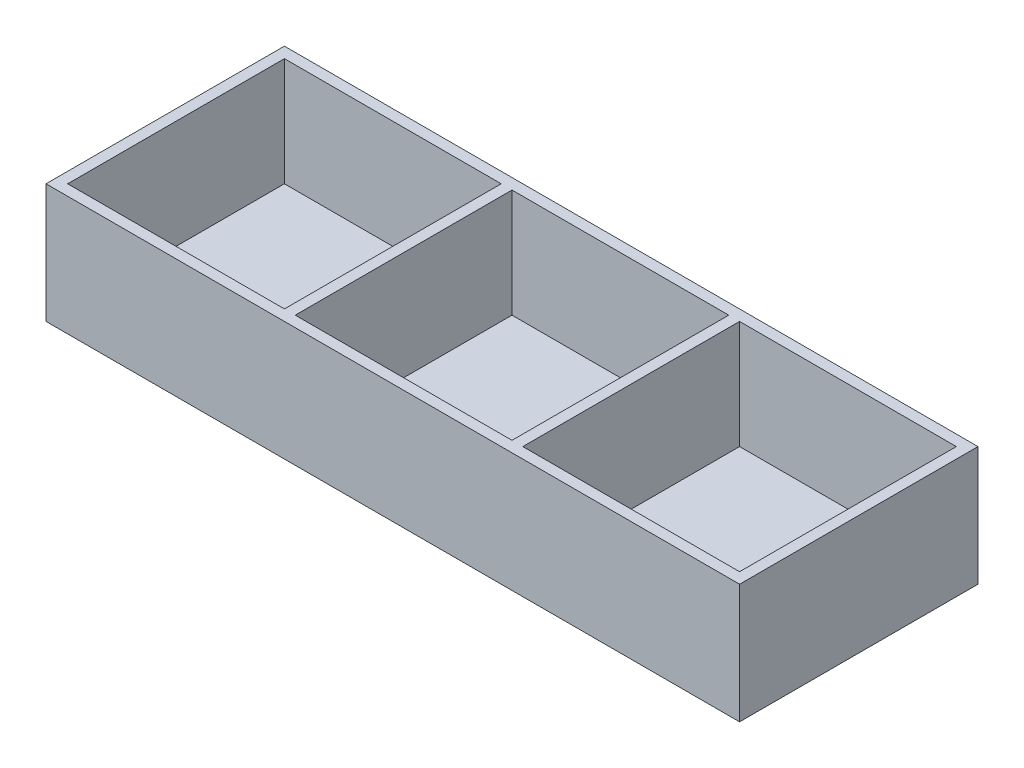
ISO-10303-21;
HEADER;
FILE_DESCRIPTION(('STEP AP214'),'2;1');
FILE_NAME('part.step','',(''),(''),'','','');
FILE_SCHEMA(('AUTOMOTIVE_DESIGN { 1 0 10303 214 1 1 1 1 }'));
ENDSEC;
DATA;
#1=APPLICATION_CONTEXT('core data for automotive mechanical design processes');
#2=APPLICATION_PROTOCOL_DEFINITION('international standard','automotive_design',2000,#1);
#3=PRODUCT_CONTEXT('',#1,'mechanical');
#4=PRODUCT('Part','Part','',(#3));
#5=PRODUCT_RELATED_PRODUCT_CATEGORY('part','',(#4));
#6=PRODUCT_DEFINITION_FORMATION('','',#4);
#7=PRODUCT_DEFINITION_CONTEXT('part definition',#1,'design');
#8=PRODUCT_DEFINITION('design','',#6,#7);
#9=PRODUCT_DEFINITION_SHAPE('','',#8);
#10=(LENGTH_UNIT() NAMED_UNIT(*) SI_UNIT(.MILLI.,.METRE.));
#11=(NAMED_UNIT(*) PLANE_ANGLE_UNIT() SI_UNIT($,.RADIAN.));
#12=(NAMED_UNIT(*) SI_UNIT($,.STERADIAN.) SOLID_ANGLE_UNIT());
#13=UNCERTAINTY_MEASURE_WITH_UNIT(LENGTH_MEASURE(1.E-05),#10,'distance_accuracy_value','');
#14=(GEOMETRIC_REPRESENTATION_CONTEXT(3) GLOBAL_UNCERTAINTY_ASSIGNED_CONTEXT((#13)) GLOBAL_UNIT_ASSIGNED_CONTEXT((#10,
#11,#12)) REPRESENTATION_CONTEXT('',''));
#15=CARTESIAN_POINT('',(0.,0.,0.));
#16=DIRECTION('',(0.,0.,1.));
#17=DIRECTION('',(1.,0.,0.));
#18=AXIS2_PLACEMENT_3D('',#15,#16,#17);
#19=CARTESIAN_POINT('',(-160.,55.,-50.));
#20=DIRECTION('',(0.,0.,1.));
#21=DIRECTION('',(1.,0.,0.));
#22=AXIS2_PLACEMENT_3D('',#19,#20,#21);
#23=PLANE('',#22);
#24=DIRECTION('',(-1.,0.,0.));
#25=VECTOR('',#24,1.);
#26=CARTESIAN_POINT('',(0.,5.,-50.));
#27=LINE('',#26,#25);
#28=CARTESIAN_POINT('',(-55.,5.00000000000001,-50.));
#29=VERTEX_POINT('',#28);
#30=CARTESIAN_POINT('',(-155.,5.,-50.));
#31=VERTEX_POINT('',#30);
#32=EDGE_CURVE('E229',#29,#31,#27,.T.);
#33=ORIENTED_EDGE('',*,*,#32,.F.);
#34=DIRECTION('',(0.,1.,0.));
#35=VECTOR('',#34,1.);
#36=CARTESIAN_POINT('',(-55.,55.,-50.));
#37=LINE('',#36,#35);
#38=CARTESIAN_POINT('',(-55.,55.,-50.));
#39=VERTEX_POINT('',#38);
#40=EDGE_CURVE('E267',#39,#29,#37,.F.);
#41=ORIENTED_EDGE('',*,*,#40,.F.);
#42=DIRECTION('',(-1.,0.,0.));
#43=VECTOR('',#42,1.);
#44=CARTESIAN_POINT('',(0.,55.,-50.));
#45=LINE('',#44,#43);
#46=CARTESIAN_POINT('',(-155.,55.,-50.));
#47=VERTEX_POINT('',#46);
#48=EDGE_CURVE('E252',#39,#47,#45,.T.);
#49=ORIENTED_EDGE('',*,*,#48,.T.);
#50=DIRECTION('',(0.,-1.,0.));
#51=VECTOR('',#50,1.);
#52=CARTESIAN_POINT('',(-155.,55.,-50.));
#53=LINE('',#52,#51);
#54=EDGE_CURVE('E233',#47,#31,#53,.T.);
#55=ORIENTED_EDGE('',*,*,#54,.T.);
#56=EDGE_LOOP('',(#33,#41,#49,#55));
#57=FACE_BOUND('',#56,.T.);
#58=ADVANCED_FACE('F34',(#57),#23,.T.);
#59=CARTESIAN_POINT('',(-160.,55.,50.));
#60=DIRECTION('',(0.,0.,-1.));
#61=DIRECTION('',(-1.,0.,0.));
#62=AXIS2_PLACEMENT_3D('',#59,#60,#61);
#63=PLANE('',#62);
#64=DIRECTION('',(1.,0.,0.));
#65=VECTOR('',#64,1.);
#66=CARTESIAN_POINT('',(0.,55.,50.));
#67=LINE('',#66,#65);
#68=CARTESIAN_POINT('',(-155.,55.,50.));
#69=VERTEX_POINT('',#68);
#70=CARTESIAN_POINT('',(-55.,55.,50.));
#71=VERTEX_POINT('',#70);
#72=EDGE_CURVE('E170',#69,#71,#67,.T.);
#73=ORIENTED_EDGE('',*,*,#72,.T.);
#74=DIRECTION('',(0.,1.,0.));
#75=VECTOR('',#74,1.);
#76=CARTESIAN_POINT('',(-55.,55.,50.));
#77=LINE('',#76,#75);
#78=CARTESIAN_POINT('',(-55.,5.,50.));
#79=VERTEX_POINT('',#78);
#80=EDGE_CURVE('E278',#71,#79,#77,.F.);
#81=ORIENTED_EDGE('',*,*,#80,.T.);
#82=DIRECTION('',(1.,0.,0.));
#83=VECTOR('',#82,1.);
#84=CARTESIAN_POINT('',(0.,5.,50.));
#85=LINE('',#84,#83);
#86=CARTESIAN_POINT('',(-155.,5.,50.));
#87=VERTEX_POINT('',#86);
#88=EDGE_CURVE('E248',#87,#79,#85,.T.);
#89=ORIENTED_EDGE('',*,*,#88,.F.);
#90=DIRECTION('',(0.,-1.,0.));
#91=VECTOR('',#90,1.);
#92=CARTESIAN_POINT('',(-155.,55.,50.));
#93=LINE('',#92,#91);
#94=EDGE_CURVE('E236',#69,#87,#93,.T.);
#95=ORIENTED_EDGE('',*,*,#94,.F.);
#96=EDGE_LOOP('',(#73,#81,#89,#95));
#97=FACE_BOUND('',#96,.T.);
#98=ADVANCED_FACE('F276',(#97),#63,.T.);
#99=CARTESIAN_POINT('',(0.,5.,0.));
#100=DIRECTION('',(0.,-1.,0.));
#101=DIRECTION('',(0.,0.,-1.));
#102=AXIS2_PLACEMENT_3D('',#99,#100,#101);
#103=PLANE('',#102);
#104=DIRECTION('',(0.,0.,1.));
#105=VECTOR('',#104,1.);
#106=CARTESIAN_POINT('',(-55.,5.,0.));
#107=LINE('',#106,#105);
#108=EDGE_CURVE('E49',#29,#79,#107,.T.);
#109=ORIENTED_EDGE('',*,*,#108,.F.);
#110=ORIENTED_EDGE('',*,*,#32,.T.);
#111=DIRECTION('',(0.,0.,1.));
#112=VECTOR('',#111,1.);
#113=CARTESIAN_POINT('',(-155.,5.,0.));
#114=LINE('',#113,#112);
#115=EDGE_CURVE('E240',#31,#87,#114,.T.);
#116=ORIENTED_EDGE('',*,*,#115,.T.);
#117=ORIENTED_EDGE('',*,*,#88,.T.);
#118=EDGE_LOOP('',(#109,#110,#116,#117));
#119=FACE_BOUND('',#118,.T.);
#120=ADVANCED_FACE('F280',(#119),#103,.F.);
#121=DIRECTION('',(0.,1.,0.));
#122=VECTOR('',#121,1.);
#123=CARTESIAN_POINT('',(-50.,55.,-50.));
#124=LINE('',#123,#122);
#125=CARTESIAN_POINT('',(-50.,55.,-50.));
#126=VERTEX_POINT('',#125);
#127=CARTESIAN_POINT('',(-50.,5.00000000000001,-50.));
#128=VERTEX_POINT('',#127);
#129=EDGE_CURVE('E153',#126,#128,#124,.F.);
#130=ORIENTED_EDGE('',*,*,#129,.T.);
#131=CARTESIAN_POINT('',(50.,5.00000000000001,-50.));
#132=VERTEX_POINT('',#131);
#133=EDGE_CURVE('E241',#132,#128,#27,.T.);
#134=ORIENTED_EDGE('',*,*,#133,.F.);
#135=DIRECTION('',(0.,1.,0.));
#136=VECTOR('',#135,1.);
#137=CARTESIAN_POINT('',(50.,55.,-50.));
#138=LINE('',#137,#136);
#139=CARTESIAN_POINT('',(50.,55.,-50.));
#140=VERTEX_POINT('',#139);
#141=EDGE_CURVE('E215',#140,#132,#138,.F.);
#142=ORIENTED_EDGE('',*,*,#141,.F.);
#143=EDGE_CURVE('E255',#140,#126,#45,.T.);
#144=ORIENTED_EDGE('',*,*,#143,.T.);
#145=EDGE_LOOP('',(#130,#134,#142,#144));
#146=FACE_BOUND('',#145,.T.);
#147=ADVANCED_FACE('F283',(#146),#23,.T.);
#148=DIRECTION('',(0.,1.,0.));
#149=VECTOR('',#148,1.);
#150=CARTESIAN_POINT('',(-50.,55.,50.));
#151=LINE('',#150,#149);
#152=CARTESIAN_POINT('',(-50.,55.,50.));
#153=VERTEX_POINT('',#152);
#154=CARTESIAN_POINT('',(-50.,5.00000000000001,50.));
#155=VERTEX_POINT('',#154);
#156=EDGE_CURVE('E151',#153,#155,#151,.F.);
#157=ORIENTED_EDGE('',*,*,#156,.F.);
#158=CARTESIAN_POINT('',(50.,55.,49.9999999999999));
#159=VERTEX_POINT('',#158);
#160=EDGE_CURVE('E162',#153,#159,#67,.T.);
#161=ORIENTED_EDGE('',*,*,#160,.T.);
#162=DIRECTION('',(0.,1.,0.));
#163=VECTOR('',#162,1.);
#164=CARTESIAN_POINT('',(50.,55.,49.9999999999999));
#165=LINE('',#164,#163);
#166=CARTESIAN_POINT('',(50.,5.,50.));
#167=VERTEX_POINT('',#166);
#168=EDGE_CURVE('E213',#159,#167,#165,.F.);
#169=ORIENTED_EDGE('',*,*,#168,.T.);
#170=EDGE_CURVE('E57',#155,#167,#85,.T.);
#171=ORIENTED_EDGE('',*,*,#170,.F.);
#172=EDGE_LOOP('',(#157,#161,#169,#171));
#173=FACE_BOUND('',#172,.T.);
#174=ADVANCED_FACE('F160',(#173),#63,.T.);
#175=ORIENTED_EDGE('',*,*,#133,.T.);
#176=DIRECTION('',(0.,0.,1.));
#177=VECTOR('',#176,1.);
#178=CARTESIAN_POINT('',(-50.,5.,0.));
#179=LINE('',#178,#177);
#180=EDGE_CURVE('E218',#128,#155,#179,.T.);
#181=ORIENTED_EDGE('',*,*,#180,.T.);
#182=ORIENTED_EDGE('',*,*,#170,.T.);
#183=DIRECTION('',(0.,0.,1.));
#184=VECTOR('',#183,1.);
#185=CARTESIAN_POINT('',(50.,5.,0.));
#186=LINE('',#185,#184);
#187=EDGE_CURVE('E38',#132,#167,#186,.T.);
#188=ORIENTED_EDGE('',*,*,#187,.F.);
#189=EDGE_LOOP('',(#175,#181,#182,#188));
#190=FACE_BOUND('',#189,.T.);
#191=ADVANCED_FACE('F281',(#190),#103,.F.);
#192=CARTESIAN_POINT('',(0.,55.,0.));
#193=DIRECTION('',(0.,-1.,0.));
#194=DIRECTION('',(0.,0.,-1.));
#195=AXIS2_PLACEMENT_3D('',#192,#193,#194);
#196=PLANE('',#195);
#197=ORIENTED_EDGE('',*,*,#160,.F.);
#198=DIRECTION('',(0.,0.,-1.));
#199=VECTOR('',#198,1.);
#200=CARTESIAN_POINT('',(-50.,55.,-50.));
#201=LINE('',#200,#199);
#202=EDGE_CURVE('E148',#126,#153,#201,.F.);
#203=ORIENTED_EDGE('',*,*,#202,.F.);
#204=ORIENTED_EDGE('',*,*,#143,.F.);
#205=DIRECTION('',(0.,0.,-1.));
#206=VECTOR('',#205,1.);
#207=CARTESIAN_POINT('',(50.,55.,-50.));
#208=LINE('',#207,#206);
#209=EDGE_CURVE('E169',#140,#159,#208,.F.);
#210=ORIENTED_EDGE('',*,*,#209,.T.);
#211=EDGE_LOOP('',(#197,#203,#204,#210));
#212=FACE_BOUND('',#211,.T.);
#213=DIRECTION('',(-1.,0.,0.));
#214=VECTOR('',#213,1.);
#215=CARTESIAN_POINT('',(-160.,55.,-55.));
#216=LINE('',#215,#214);
#217=CARTESIAN_POINT('',(160.,55.,-55.));
#218=VERTEX_POINT('',#217);
#219=CARTESIAN_POINT('',(-160.,55.,-55.));
#220=VERTEX_POINT('',#219);
#221=EDGE_CURVE('E182',#218,#220,#216,.T.);
#222=ORIENTED_EDGE('',*,*,#221,.T.);
#223=DIRECTION('',(0.,0.,1.));
#224=VECTOR('',#223,1.);
#225=CARTESIAN_POINT('',(-160.,55.,55.));
#226=LINE('',#225,#224);
#227=CARTESIAN_POINT('',(-160.,55.,55.));
#228=VERTEX_POINT('',#227);
#229=EDGE_CURVE('E185',#220,#228,#226,.T.);
#230=ORIENTED_EDGE('',*,*,#229,.T.);
#231=DIRECTION('',(1.,0.,0.));
#232=VECTOR('',#231,1.);
#233=CARTESIAN_POINT('',(-160.,55.,55.));
#234=LINE('',#233,#232);
#235=CARTESIAN_POINT('',(160.,55.,55.));
#236=VERTEX_POINT('',#235);
#237=EDGE_CURVE('E187',#228,#236,#234,.T.);
#238=ORIENTED_EDGE('',*,*,#237,.T.);
#239=DIRECTION('',(0.,0.,-1.));
#240=VECTOR('',#239,1.);
#241=CARTESIAN_POINT('',(160.,55.,55.));
#242=LINE('',#241,#240);
#243=EDGE_CURVE('E179',#236,#218,#242,.T.);
#244=ORIENTED_EDGE('',*,*,#243,.T.);
#245=EDGE_LOOP('',(#222,#230,#238,#244));
#246=FACE_BOUND('',#245,.T.);
#247=ORIENTED_EDGE('',*,*,#48,.F.);
#248=DIRECTION('',(0.,0.,-1.));
#249=VECTOR('',#248,1.);
#250=CARTESIAN_POINT('',(-55.,55.,-50.));
#251=LINE('',#250,#249);
#252=EDGE_CURVE('E164',#39,#71,#251,.F.);
#253=ORIENTED_EDGE('',*,*,#252,.T.);
#254=ORIENTED_EDGE('',*,*,#72,.F.);
#255=DIRECTION('',(0.,0.,1.));
#256=VECTOR('',#255,1.);
#257=CARTESIAN_POINT('',(-155.,55.,0.));
#258=LINE('',#257,#256);
#259=EDGE_CURVE('E175',#47,#69,#258,.T.);
#260=ORIENTED_EDGE('',*,*,#259,.F.);
#261=EDGE_LOOP('',(#247,#253,#254,#260));
#262=FACE_BOUND('',#261,.T.);
#263=DIRECTION('',(0.,0.,-1.));
#264=VECTOR('',#263,1.);
#265=CARTESIAN_POINT('',(55.,55.,-50.));
#266=LINE('',#265,#264);
#267=CARTESIAN_POINT('',(55.,55.,-50.));
#268=VERTEX_POINT('',#267);
#269=CARTESIAN_POINT('',(55.,55.,49.9999999999999));
#270=VERTEX_POINT('',#269);
#271=EDGE_CURVE('E230',#268,#270,#266,.F.);
#272=ORIENTED_EDGE('',*,*,#271,.F.);
#273=CARTESIAN_POINT('',(155.,55.,-50.));
#274=VERTEX_POINT('',#273);
#275=EDGE_CURVE('E253',#274,#268,#45,.T.);
#276=ORIENTED_EDGE('',*,*,#275,.F.);
#277=DIRECTION('',(0.,0.,-1.));
#278=VECTOR('',#277,1.);
#279=CARTESIAN_POINT('',(155.,55.,0.));
#280=LINE('',#279,#278);
#281=CARTESIAN_POINT('',(155.,55.,50.));
#282=VERTEX_POINT('',#281);
#283=EDGE_CURVE('E251',#282,#274,#280,.T.);
#284=ORIENTED_EDGE('',*,*,#283,.F.);
#285=EDGE_CURVE('E171',#270,#282,#67,.T.);
#286=ORIENTED_EDGE('',*,*,#285,.F.);
#287=EDGE_LOOP('',(#272,#276,#284,#286));
#288=FACE_BOUND('',#287,.T.);
#289=ADVANCED_FACE('F167',(#212,#246,#262,#288),#196,.F.);
#290=CARTESIAN_POINT('',(160.,55.,55.));
#291=DIRECTION('',(-1.,0.,0.));
#292=DIRECTION('',(0.,0.,1.));
#293=AXIS2_PLACEMENT_3D('',#290,#291,#292);
#294=PLANE('',#293);
#295=DIRECTION('',(0.,0.,-1.));
#296=VECTOR('',#295,1.);
#297=CARTESIAN_POINT('',(160.,0.,55.));
#298=LINE('',#297,#296);
#299=CARTESIAN_POINT('',(160.,0.,55.));
#300=VERTEX_POINT('',#299);
#301=CARTESIAN_POINT('',(160.,0.,-55.));
#302=VERTEX_POINT('',#301);
#303=EDGE_CURVE('E190',#300,#302,#298,.T.);
#304=ORIENTED_EDGE('',*,*,#303,.T.);
#305=DIRECTION('',(0.,-1.,0.));
#306=VECTOR('',#305,1.);
#307=CARTESIAN_POINT('',(160.,55.,-55.));
#308=LINE('',#307,#306);
#309=EDGE_CURVE('E207',#218,#302,#308,.T.);
#310=ORIENTED_EDGE('',*,*,#309,.F.);
#311=ORIENTED_EDGE('',*,*,#243,.F.);
#312=DIRECTION('',(0.,-1.,0.));
#313=VECTOR('',#312,1.);
#314=CARTESIAN_POINT('',(160.,55.,55.));
#315=LINE('',#314,#313);
#316=EDGE_CURVE('E189',#236,#300,#315,.T.);
#317=ORIENTED_EDGE('',*,*,#316,.T.);
#318=EDGE_LOOP('',(#304,#310,#311,#317));
#319=FACE_BOUND('',#318,.T.);
#320=ADVANCED_FACE('F36',(#319),#294,.F.);
#321=CARTESIAN_POINT('',(-160.,55.,-55.));
#322=DIRECTION('',(0.,0.,1.));
#323=DIRECTION('',(1.,0.,0.));
#324=AXIS2_PLACEMENT_3D('',#321,#322,#323);
#325=PLANE('',#324);
#326=DIRECTION('',(0.,-1.,0.));
#327=VECTOR('',#326,1.);
#328=CARTESIAN_POINT('',(-160.,55.,-55.));
#329=LINE('',#328,#327);
#330=CARTESIAN_POINT('',(-160.,0.,-55.));
#331=VERTEX_POINT('',#330);
#332=EDGE_CURVE('E204',#220,#331,#329,.T.);
#333=ORIENTED_EDGE('',*,*,#332,.F.);
#334=ORIENTED_EDGE('',*,*,#221,.F.);
#335=ORIENTED_EDGE('',*,*,#309,.T.);
#336=DIRECTION('',(-1.,0.,0.));
#337=VECTOR('',#336,1.);
#338=CARTESIAN_POINT('',(-160.,0.,-55.));
#339=LINE('',#338,#337);
#340=EDGE_CURVE('E193',#302,#331,#339,.T.);
#341=ORIENTED_EDGE('',*,*,#340,.T.);
#342=EDGE_LOOP('',(#333,#334,#335,#341));
#343=FACE_BOUND('',#342,.T.);
#344=ADVANCED_FACE('F387',(#343),#325,.F.);
#345=CARTESIAN_POINT('',(-160.,55.,55.));
#346=DIRECTION('',(1.,0.,0.));
#347=DIRECTION('',(0.,0.,-1.));
#348=AXIS2_PLACEMENT_3D('',#345,#346,#347);
#349=PLANE('',#348);
#350=DIRECTION('',(0.,0.,1.));
#351=VECTOR('',#350,1.);
#352=CARTESIAN_POINT('',(-160.,0.,55.));
#353=LINE('',#352,#351);
#354=CARTESIAN_POINT('',(-160.,0.,55.));
#355=VERTEX_POINT('',#354);
#356=EDGE_CURVE('E196',#331,#355,#353,.T.);
#357=ORIENTED_EDGE('',*,*,#356,.T.);
#358=DIRECTION('',(0.,-1.,0.));
#359=VECTOR('',#358,1.);
#360=CARTESIAN_POINT('',(-160.,55.,55.));
#361=LINE('',#360,#359);
#362=EDGE_CURVE('E201',#228,#355,#361,.T.);
#363=ORIENTED_EDGE('',*,*,#362,.F.);
#364=ORIENTED_EDGE('',*,*,#229,.F.);
#365=ORIENTED_EDGE('',*,*,#332,.T.);
#366=EDGE_LOOP('',(#357,#363,#364,#365));
#367=FACE_BOUND('',#366,.T.);
#368=ADVANCED_FACE('F392',(#367),#349,.F.);
#369=CARTESIAN_POINT('',(-160.,55.,55.));
#370=DIRECTION('',(0.,0.,-1.));
#371=DIRECTION('',(-1.,0.,0.));
#372=AXIS2_PLACEMENT_3D('',#369,#370,#371);
#373=PLANE('',#372);
#374=ORIENTED_EDGE('',*,*,#316,.F.);
#375=ORIENTED_EDGE('',*,*,#237,.F.);
#376=ORIENTED_EDGE('',*,*,#362,.T.);
#377=DIRECTION('',(1.,0.,0.));
#378=VECTOR('',#377,1.);
#379=CARTESIAN_POINT('',(-160.,0.,55.));
#380=LINE('',#379,#378);
#381=EDGE_CURVE('E183',#355,#300,#380,.T.);
#382=ORIENTED_EDGE('',*,*,#381,.T.);
#383=EDGE_LOOP('',(#374,#375,#376,#382));
#384=FACE_BOUND('',#383,.T.);
#385=ADVANCED_FACE('F336',(#384),#373,.F.);
#386=CARTESIAN_POINT('',(0.,0.,0.));
#387=DIRECTION('',(0.,-1.,0.));
#388=DIRECTION('',(0.,0.,-1.));
#389=AXIS2_PLACEMENT_3D('',#386,#387,#388);
#390=PLANE('',#389);
#391=ORIENTED_EDGE('',*,*,#356,.F.);
#392=ORIENTED_EDGE('',*,*,#340,.F.);
#393=ORIENTED_EDGE('',*,*,#303,.F.);
#394=ORIENTED_EDGE('',*,*,#381,.F.);
#395=EDGE_LOOP('',(#391,#392,#393,#394));
#396=FACE_BOUND('',#395,.T.);
#397=ADVANCED_FACE('F332',(#396),#390,.T.);
#398=CARTESIAN_POINT('',(155.,55.,55.));
#399=DIRECTION('',(-1.,0.,0.));
#400=DIRECTION('',(0.,0.,1.));
#401=AXIS2_PLACEMENT_3D('',#398,#399,#400);
#402=PLANE('',#401);
#403=DIRECTION('',(0.,0.,-1.));
#404=VECTOR('',#403,1.);
#405=CARTESIAN_POINT('',(155.,5.,0.));
#406=LINE('',#405,#404);
#407=CARTESIAN_POINT('',(155.,5.,50.));
#408=VERTEX_POINT('',#407);
#409=CARTESIAN_POINT('',(155.,5.,-50.));
#410=VERTEX_POINT('',#409);
#411=EDGE_CURVE('E226',#408,#410,#406,.T.);
#412=ORIENTED_EDGE('',*,*,#411,.F.);
#413=DIRECTION('',(0.,-1.,0.));
#414=VECTOR('',#413,1.);
#415=CARTESIAN_POINT('',(155.,55.,50.));
#416=LINE('',#415,#414);
#417=EDGE_CURVE('E174',#282,#408,#416,.T.);
#418=ORIENTED_EDGE('',*,*,#417,.F.);
#419=ORIENTED_EDGE('',*,*,#283,.T.);
#420=DIRECTION('',(0.,-1.,0.));
#421=VECTOR('',#420,1.);
#422=CARTESIAN_POINT('',(155.,55.,-50.));
#423=LINE('',#422,#421);
#424=EDGE_CURVE('E194',#274,#410,#423,.T.);
#425=ORIENTED_EDGE('',*,*,#424,.T.);
#426=EDGE_LOOP('',(#412,#418,#419,#425));
#427=FACE_BOUND('',#426,.T.);
#428=ADVANCED_FACE('F304',(#427),#402,.T.);
#429=DIRECTION('',(0.,1.,0.));
#430=VECTOR('',#429,1.);
#431=CARTESIAN_POINT('',(55.,55.,-50.));
#432=LINE('',#431,#430);
#433=CARTESIAN_POINT('',(55.,5.00000000000001,-50.));
#434=VERTEX_POINT('',#433);
#435=EDGE_CURVE('E290',#268,#434,#432,.F.);
#436=ORIENTED_EDGE('',*,*,#435,.T.);
#437=EDGE_CURVE('E237',#410,#434,#27,.T.);
#438=ORIENTED_EDGE('',*,*,#437,.F.);
#439=ORIENTED_EDGE('',*,*,#424,.F.);
#440=ORIENTED_EDGE('',*,*,#275,.T.);
#441=EDGE_LOOP('',(#436,#438,#439,#440));
#442=FACE_BOUND('',#441,.T.);
#443=ADVANCED_FACE('F305',(#442),#23,.T.);
#444=CARTESIAN_POINT('',(-155.,55.,55.));
#445=DIRECTION('',(1.,0.,0.));
#446=DIRECTION('',(0.,0.,-1.));
#447=AXIS2_PLACEMENT_3D('',#444,#445,#446);
#448=PLANE('',#447);
#449=ORIENTED_EDGE('',*,*,#115,.F.);
#450=ORIENTED_EDGE('',*,*,#54,.F.);
#451=ORIENTED_EDGE('',*,*,#259,.T.);
#452=ORIENTED_EDGE('',*,*,#94,.T.);
#453=EDGE_LOOP('',(#449,#450,#451,#452));
#454=FACE_BOUND('',#453,.T.);
#455=ADVANCED_FACE('F272',(#454),#448,.T.);
#456=DIRECTION('',(0.,1.,0.));
#457=VECTOR('',#456,1.);
#458=CARTESIAN_POINT('',(55.,55.,49.9999999999999));
#459=LINE('',#458,#457);
#460=CARTESIAN_POINT('',(55.,5.00000000000001,49.9999999999999));
#461=VERTEX_POINT('',#460);
#462=EDGE_CURVE('E225',#270,#461,#459,.F.);
#463=ORIENTED_EDGE('',*,*,#462,.F.);
#464=ORIENTED_EDGE('',*,*,#285,.T.);
#465=ORIENTED_EDGE('',*,*,#417,.T.);
#466=EDGE_CURVE('E245',#461,#408,#85,.T.);
#467=ORIENTED_EDGE('',*,*,#466,.F.);
#468=EDGE_LOOP('',(#463,#464,#465,#467));
#469=FACE_BOUND('',#468,.T.);
#470=ADVANCED_FACE('F299',(#469),#63,.T.);
#471=ORIENTED_EDGE('',*,*,#437,.T.);
#472=DIRECTION('',(0.,0.,1.));
#473=VECTOR('',#472,1.);
#474=CARTESIAN_POINT('',(55.,5.,0.));
#475=LINE('',#474,#473);
#476=EDGE_CURVE('E11',#434,#461,#475,.T.);
#477=ORIENTED_EDGE('',*,*,#476,.T.);
#478=ORIENTED_EDGE('',*,*,#466,.T.);
#479=ORIENTED_EDGE('',*,*,#411,.T.);
#480=EDGE_LOOP('',(#471,#477,#478,#479));
#481=FACE_BOUND('',#480,.T.);
#482=ADVANCED_FACE('F307',(#481),#103,.F.);
#483=CARTESIAN_POINT('',(55.,55.,-50.));
#484=DIRECTION('',(1.,0.,0.));
#485=DIRECTION('',(0.,0.,-1.));
#486=AXIS2_PLACEMENT_3D('',#483,#484,#485);
#487=PLANE('',#486);
#488=ORIENTED_EDGE('',*,*,#476,.F.);
#489=ORIENTED_EDGE('',*,*,#435,.F.);
#490=ORIENTED_EDGE('',*,*,#271,.T.);
#491=ORIENTED_EDGE('',*,*,#462,.T.);
#492=EDGE_LOOP('',(#488,#489,#490,#491));
#493=FACE_BOUND('',#492,.T.);
#494=ADVANCED_FACE('F295',(#493),#487,.T.);
#495=CARTESIAN_POINT('',(50.,55.,-50.));
#496=DIRECTION('',(1.,0.,0.));
#497=DIRECTION('',(0.,0.,-1.));
#498=AXIS2_PLACEMENT_3D('',#495,#496,#497);
#499=PLANE('',#498);
#500=ORIENTED_EDGE('',*,*,#141,.T.);
#501=ORIENTED_EDGE('',*,*,#187,.T.);
#502=ORIENTED_EDGE('',*,*,#168,.F.);
#503=ORIENTED_EDGE('',*,*,#209,.F.);
#504=EDGE_LOOP('',(#500,#501,#502,#503));
#505=FACE_BOUND('',#504,.T.);
#506=ADVANCED_FACE('F212',(#505),#499,.F.);
#507=CARTESIAN_POINT('',(-50.,55.,-50.));
#508=DIRECTION('',(1.,0.,0.));
#509=DIRECTION('',(0.,0.,-1.));
#510=AXIS2_PLACEMENT_3D('',#507,#508,#509);
#511=PLANE('',#510);
#512=ORIENTED_EDGE('',*,*,#180,.F.);
#513=ORIENTED_EDGE('',*,*,#129,.F.);
#514=ORIENTED_EDGE('',*,*,#202,.T.);
#515=ORIENTED_EDGE('',*,*,#156,.T.);
#516=EDGE_LOOP('',(#512,#513,#514,#515));
#517=FACE_BOUND('',#516,.T.);
#518=ADVANCED_FACE('F150',(#517),#511,.T.);
#519=CARTESIAN_POINT('',(-55.,55.,-50.));
#520=DIRECTION('',(1.,0.,0.));
#521=DIRECTION('',(0.,0.,-1.));
#522=AXIS2_PLACEMENT_3D('',#519,#520,#521);
#523=PLANE('',#522);
#524=ORIENTED_EDGE('',*,*,#40,.T.);
#525=ORIENTED_EDGE('',*,*,#108,.T.);
#526=ORIENTED_EDGE('',*,*,#80,.F.);
#527=ORIENTED_EDGE('',*,*,#252,.F.);
#528=EDGE_LOOP('',(#524,#525,#526,#527));
#529=FACE_BOUND('',#528,.T.);
#530=ADVANCED_FACE('F342',(#529),#523,.F.);
#531=CLOSED_SHELL('',(#58,#98,#120,#147,#174,#191,#289,#320,#344,#368,#385,#397,#428,#443,#455,
#470,#482,#494,#506,#518,#530));
#532=MANIFOLD_SOLID_BREP('B2',#531);
#533=ADVANCED_BREP_SHAPE_REPRESENTATION('',(#18,#532),#14);
#534=SHAPE_DEFINITION_REPRESENTATION(#9,#533);
ENDSEC;
END-ISO-10303-21;
